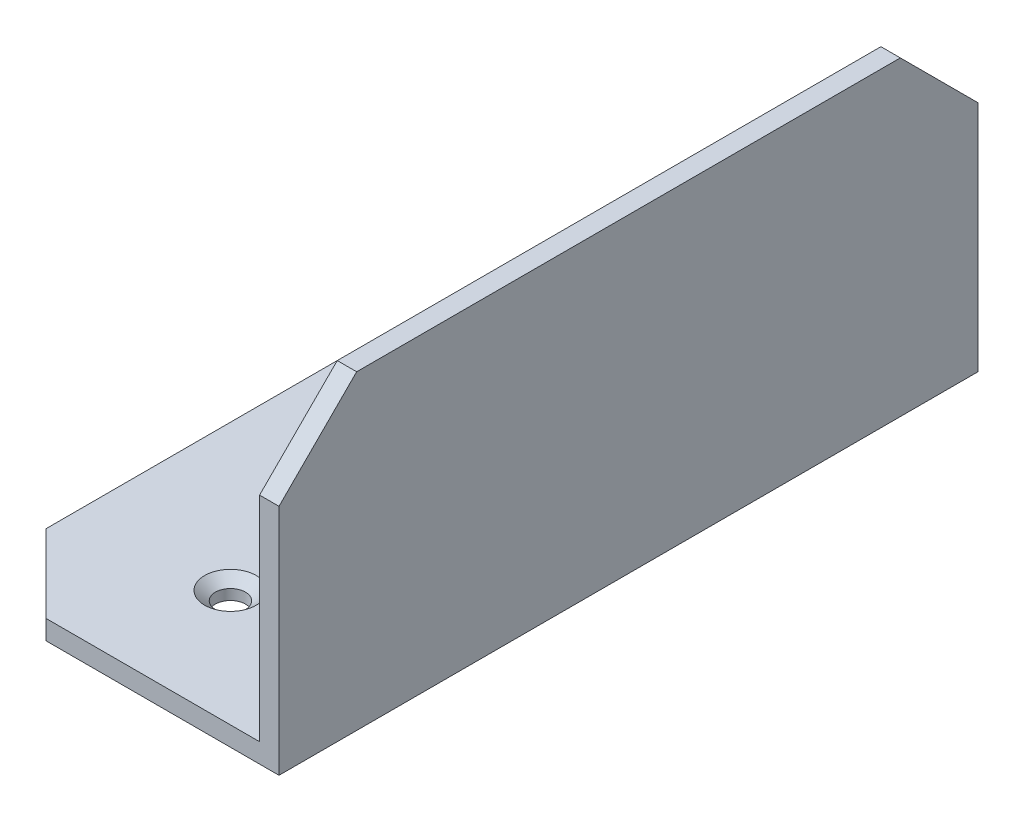
ISO-10303-21;
HEADER;
FILE_DESCRIPTION(('STEP AP214'),'2;1');
FILE_NAME('part.step','',(''),(''),'','','');
FILE_SCHEMA(('AUTOMOTIVE_DESIGN { 1 0 10303 214 1 1 1 1 }'));
ENDSEC;
DATA;
#1=APPLICATION_CONTEXT('core data for automotive mechanical design processes');
#2=APPLICATION_PROTOCOL_DEFINITION('international standard','automotive_design',2000,#1);
#3=PRODUCT_CONTEXT('',#1,'mechanical');
#4=PRODUCT('Part','Part','',(#3));
#5=PRODUCT_RELATED_PRODUCT_CATEGORY('part','',(#4));
#6=PRODUCT_DEFINITION_FORMATION('','',#4);
#7=PRODUCT_DEFINITION_CONTEXT('part definition',#1,'design');
#8=PRODUCT_DEFINITION('design','',#6,#7);
#9=PRODUCT_DEFINITION_SHAPE('','',#8);
#10=(LENGTH_UNIT() NAMED_UNIT(*) SI_UNIT(.MILLI.,.METRE.));
#11=(NAMED_UNIT(*) PLANE_ANGLE_UNIT() SI_UNIT($,.RADIAN.));
#12=(NAMED_UNIT(*) SI_UNIT($,.STERADIAN.) SOLID_ANGLE_UNIT());
#13=UNCERTAINTY_MEASURE_WITH_UNIT(LENGTH_MEASURE(1.E-05),#10,'distance_accuracy_value','');
#14=(GEOMETRIC_REPRESENTATION_CONTEXT(3) GLOBAL_UNCERTAINTY_ASSIGNED_CONTEXT((#13)) GLOBAL_UNIT_ASSIGNED_CONTEXT((#10,
#11,#12)) REPRESENTATION_CONTEXT('',''));
#15=CARTESIAN_POINT('',(0.,0.,0.));
#16=DIRECTION('',(0.,0.,1.));
#17=DIRECTION('',(1.,0.,0.));
#18=AXIS2_PLACEMENT_3D('',#15,#16,#17);
#19=CARTESIAN_POINT('',(0.,0.,-114.3));
#20=DIRECTION('',(0.,-1.,0.));
#21=DIRECTION('',(0.,0.,-1.));
#22=AXIS2_PLACEMENT_3D('',#19,#20,#21);
#23=PLANE('',#22);
#24=CARTESIAN_POINT('',(-26.9875,0.,-19.05));
#25=DIRECTION('',(0.,1.,0.));
#26=DIRECTION('',(0.,0.,1.));
#27=AXIS2_PLACEMENT_3D('',#24,#25,#26);
#28=CIRCLE('',#27,2.45745);
#29=CARTESIAN_POINT('',(-26.9875,0.,-16.59255));
#30=VERTEX_POINT('',#29);
#31=EDGE_CURVE('E382',#30,#30,#28,.T.);
#32=ORIENTED_EDGE('',*,*,#31,.T.);
#33=EDGE_LOOP('',(#32));
#34=FACE_BOUND('',#33,.T.);
#35=CARTESIAN_POINT('',(-26.9875,0.,-57.15));
#36=DIRECTION('',(0.,1.,0.));
#37=DIRECTION('',(0.,0.,1.));
#38=AXIS2_PLACEMENT_3D('',#35,#36,#37);
#39=CIRCLE('',#38,2.45745);
#40=CARTESIAN_POINT('',(-26.9875,0.,-54.69255));
#41=VERTEX_POINT('',#40);
#42=EDGE_CURVE('E392',#41,#41,#39,.T.);
#43=ORIENTED_EDGE('',*,*,#42,.T.);
#44=EDGE_LOOP('',(#43));
#45=FACE_BOUND('',#44,.T.);
#46=CARTESIAN_POINT('',(-26.9875,0.,-95.25));
#47=DIRECTION('',(0.,1.,0.));
#48=DIRECTION('',(0.,0.,1.));
#49=AXIS2_PLACEMENT_3D('',#46,#47,#48);
#50=CIRCLE('',#49,2.45745);
#51=CARTESIAN_POINT('',(-26.9875,0.,-92.79255));
#52=VERTEX_POINT('',#51);
#53=EDGE_CURVE('E147',#52,#52,#50,.T.);
#54=ORIENTED_EDGE('',*,*,#53,.T.);
#55=EDGE_LOOP('',(#54));
#56=FACE_BOUND('',#55,.T.);
#57=DIRECTION('',(0.,0.,1.));
#58=VECTOR('',#57,1.);
#59=CARTESIAN_POINT('',(-50.8,0.,-114.3));
#60=LINE('',#59,#58);
#61=CARTESIAN_POINT('',(-50.8,0.,-101.6));
#62=VERTEX_POINT('',#61);
#63=CARTESIAN_POINT('',(-50.8,0.,-12.7000000000001));
#64=VERTEX_POINT('',#63);
#65=EDGE_CURVE('E153',#62,#64,#60,.T.);
#66=ORIENTED_EDGE('',*,*,#65,.F.);
#67=DIRECTION('',(-0.707106781186549,0.,0.707106781186546));
#68=VECTOR('',#67,1.);
#69=CARTESIAN_POINT('',(-19.0499999999999,0.,-133.35));
#70=LINE('',#69,#68);
#71=CARTESIAN_POINT('',(-38.0999999999999,0.,-114.3));
#72=VERTEX_POINT('',#71);
#73=EDGE_CURVE('E120',#62,#72,#70,.F.);
#74=ORIENTED_EDGE('',*,*,#73,.T.);
#75=DIRECTION('',(1.,0.,0.));
#76=VECTOR('',#75,1.);
#77=CARTESIAN_POINT('',(0.,0.,-114.3));
#78=LINE('',#77,#76);
#79=CARTESIAN_POINT('',(0.,0.,-114.3));
#80=VERTEX_POINT('',#79);
#81=EDGE_CURVE('E115',#72,#80,#78,.T.);
#82=ORIENTED_EDGE('',*,*,#81,.T.);
#83=DIRECTION('',(0.,0.,1.));
#84=VECTOR('',#83,1.);
#85=CARTESIAN_POINT('',(0.,0.,-114.3));
#86=LINE('',#85,#84);
#87=CARTESIAN_POINT('',(0.,0.,0.));
#88=VERTEX_POINT('',#87);
#89=EDGE_CURVE('E119',#80,#88,#86,.T.);
#90=ORIENTED_EDGE('',*,*,#89,.T.);
#91=DIRECTION('',(1.,0.,0.));
#92=VECTOR('',#91,1.);
#93=CARTESIAN_POINT('',(0.,0.,0.));
#94=LINE('',#93,#92);
#95=CARTESIAN_POINT('',(-38.1,0.,0.));
#96=VERTEX_POINT('',#95);
#97=EDGE_CURVE('E145',#96,#88,#94,.T.);
#98=ORIENTED_EDGE('',*,*,#97,.F.);
#99=DIRECTION('',(-0.707106781186546,0.,-0.707106781186549));
#100=VECTOR('',#99,1.);
#101=CARTESIAN_POINT('',(-76.2000000000001,0.,-38.1000000000002));
#102=LINE('',#101,#100);
#103=EDGE_CURVE('E171',#96,#64,#102,.T.);
#104=ORIENTED_EDGE('',*,*,#103,.T.);
#105=EDGE_LOOP('',(#66,#74,#82,#90,#98,#104));
#106=FACE_BOUND('',#105,.T.);
#107=ADVANCED_FACE('F35',(#34,#45,#56,#106),#23,.T.);
#108=CARTESIAN_POINT('',(-50.8,0.,-114.3));
#109=DIRECTION('',(-1.,0.,0.));
#110=DIRECTION('',(0.,0.,1.));
#111=AXIS2_PLACEMENT_3D('',#108,#109,#110);
#112=PLANE('',#111);
#113=DIRECTION('',(0.,0.,1.));
#114=VECTOR('',#113,1.);
#115=CARTESIAN_POINT('',(-50.8,3.175,-114.3));
#116=LINE('',#115,#114);
#117=CARTESIAN_POINT('',(-50.8,3.175,-101.6));
#118=VERTEX_POINT('',#117);
#119=CARTESIAN_POINT('',(-50.8,3.175,-12.7000000000001));
#120=VERTEX_POINT('',#119);
#121=EDGE_CURVE('E157',#118,#120,#116,.T.);
#122=ORIENTED_EDGE('',*,*,#121,.F.);
#123=DIRECTION('',(0.,-1.,0.));
#124=VECTOR('',#123,1.);
#125=CARTESIAN_POINT('',(-50.8,0.,-101.6));
#126=LINE('',#125,#124);
#127=EDGE_CURVE('E168',#118,#62,#126,.T.);
#128=ORIENTED_EDGE('',*,*,#127,.T.);
#129=ORIENTED_EDGE('',*,*,#65,.T.);
#130=DIRECTION('',(0.,1.,0.));
#131=VECTOR('',#130,1.);
#132=CARTESIAN_POINT('',(-50.8,3.175,-12.7000000000001));
#133=LINE('',#132,#131);
#134=EDGE_CURVE('E156',#64,#120,#133,.T.);
#135=ORIENTED_EDGE('',*,*,#134,.T.);
#136=EDGE_LOOP('',(#122,#128,#129,#135));
#137=FACE_BOUND('',#136,.T.);
#138=ADVANCED_FACE('F201',(#137),#112,.T.);
#139=CARTESIAN_POINT('',(-3.175,3.175,-114.3));
#140=DIRECTION('',(0.,1.,0.));
#141=DIRECTION('',(0.,0.,1.));
#142=AXIS2_PLACEMENT_3D('',#139,#140,#141);
#143=PLANE('',#142);
#144=CARTESIAN_POINT('',(-26.9875,3.175,-19.05));
#145=DIRECTION('',(0.,1.,0.));
#146=DIRECTION('',(0.,0.,1.));
#147=AXIS2_PLACEMENT_3D('',#144,#145,#146);
#148=CIRCLE('',#147,4.2164);
#149=CARTESIAN_POINT('',(-26.9875,3.175,-14.8336));
#150=VERTEX_POINT('',#149);
#151=EDGE_CURVE('E380',#150,#150,#148,.T.);
#152=ORIENTED_EDGE('',*,*,#151,.F.);
#153=EDGE_LOOP('',(#152));
#154=FACE_BOUND('',#153,.T.);
#155=CARTESIAN_POINT('',(-26.9875,3.175,-57.15));
#156=DIRECTION('',(0.,1.,0.));
#157=DIRECTION('',(0.,0.,1.));
#158=AXIS2_PLACEMENT_3D('',#155,#156,#157);
#159=CIRCLE('',#158,4.2164);
#160=CARTESIAN_POINT('',(-26.9875,3.175,-52.9336));
#161=VERTEX_POINT('',#160);
#162=EDGE_CURVE('E386',#161,#161,#159,.T.);
#163=ORIENTED_EDGE('',*,*,#162,.F.);
#164=EDGE_LOOP('',(#163));
#165=FACE_BOUND('',#164,.T.);
#166=CARTESIAN_POINT('',(-26.9875,3.175,-95.25));
#167=DIRECTION('',(0.,1.,0.));
#168=DIRECTION('',(0.,0.,1.));
#169=AXIS2_PLACEMENT_3D('',#166,#167,#168);
#170=CIRCLE('',#169,4.2164);
#171=CARTESIAN_POINT('',(-26.9875,3.175,-91.0336));
#172=VERTEX_POINT('',#171);
#173=EDGE_CURVE('E395',#172,#172,#170,.T.);
#174=ORIENTED_EDGE('',*,*,#173,.F.);
#175=EDGE_LOOP('',(#174));
#176=FACE_BOUND('',#175,.T.);
#177=DIRECTION('',(-1.,0.,0.));
#178=VECTOR('',#177,1.);
#179=CARTESIAN_POINT('',(-3.175,3.175,-114.3));
#180=LINE('',#179,#178);
#181=CARTESIAN_POINT('',(-3.175,3.175,-114.3));
#182=VERTEX_POINT('',#181);
#183=CARTESIAN_POINT('',(-38.0999999999999,3.175,-114.3));
#184=VERTEX_POINT('',#183);
#185=EDGE_CURVE('E132',#182,#184,#180,.T.);
#186=ORIENTED_EDGE('',*,*,#185,.T.);
#187=DIRECTION('',(0.707106781186549,0.,-0.707106781186546));
#188=VECTOR('',#187,1.);
#189=CARTESIAN_POINT('',(-20.6374999999999,3.175,-131.7625));
#190=LINE('',#189,#188);
#191=EDGE_CURVE('E179',#184,#118,#190,.F.);
#192=ORIENTED_EDGE('',*,*,#191,.T.);
#193=ORIENTED_EDGE('',*,*,#121,.T.);
#194=DIRECTION('',(0.707106781186546,0.,0.707106781186549));
#195=VECTOR('',#194,1.);
#196=CARTESIAN_POINT('',(-77.7875000000001,3.175,-39.6875000000002));
#197=LINE('',#196,#195);
#198=CARTESIAN_POINT('',(-38.1,3.175,0.));
#199=VERTEX_POINT('',#198);
#200=EDGE_CURVE('E177',#120,#199,#197,.T.);
#201=ORIENTED_EDGE('',*,*,#200,.T.);
#202=DIRECTION('',(-1.,0.,0.));
#203=VECTOR('',#202,1.);
#204=CARTESIAN_POINT('',(-3.175,3.175,0.));
#205=LINE('',#204,#203);
#206=CARTESIAN_POINT('',(-3.175,3.175,0.));
#207=VERTEX_POINT('',#206);
#208=EDGE_CURVE('E125',#207,#199,#205,.T.);
#209=ORIENTED_EDGE('',*,*,#208,.F.);
#210=DIRECTION('',(0.,0.,1.));
#211=VECTOR('',#210,1.);
#212=CARTESIAN_POINT('',(-3.175,3.175,-114.3));
#213=LINE('',#212,#211);
#214=EDGE_CURVE('E160',#182,#207,#213,.T.);
#215=ORIENTED_EDGE('',*,*,#214,.F.);
#216=EDGE_LOOP('',(#186,#192,#193,#201,#209,#215));
#217=FACE_BOUND('',#216,.T.);
#218=ADVANCED_FACE('F204',(#154,#165,#176,#217),#143,.T.);
#219=CARTESIAN_POINT('',(-3.175,3.175,-114.3));
#220=DIRECTION('',(-1.,0.,0.));
#221=DIRECTION('',(0.,0.,1.));
#222=AXIS2_PLACEMENT_3D('',#219,#220,#221);
#223=PLANE('',#222);
#224=DIRECTION('',(0.,0.,1.));
#225=VECTOR('',#224,1.);
#226=CARTESIAN_POINT('',(-3.175,50.8,-114.3));
#227=LINE('',#226,#225);
#228=CARTESIAN_POINT('',(-3.175,50.8,-101.6));
#229=VERTEX_POINT('',#228);
#230=CARTESIAN_POINT('',(-3.175,50.8,-12.7000000000001));
#231=VERTEX_POINT('',#230);
#232=EDGE_CURVE('E163',#229,#231,#227,.T.);
#233=ORIENTED_EDGE('',*,*,#232,.F.);
#234=DIRECTION('',(0.,0.707106781186549,0.707106781186546));
#235=VECTOR('',#234,1.);
#236=CARTESIAN_POINT('',(-3.175,20.6374999999999,-131.7625));
#237=LINE('',#236,#235);
#238=CARTESIAN_POINT('',(-3.175,38.0999999999999,-114.3));
#239=VERTEX_POINT('',#238);
#240=EDGE_CURVE('E187',#229,#239,#237,.F.);
#241=ORIENTED_EDGE('',*,*,#240,.T.);
#242=DIRECTION('',(0.,-1.,0.));
#243=VECTOR('',#242,1.);
#244=CARTESIAN_POINT('',(-3.175,3.175,-114.3));
#245=LINE('',#244,#243);
#246=EDGE_CURVE('E138',#239,#182,#245,.T.);
#247=ORIENTED_EDGE('',*,*,#246,.T.);
#248=ORIENTED_EDGE('',*,*,#214,.T.);
#249=DIRECTION('',(0.,-1.,0.));
#250=VECTOR('',#249,1.);
#251=CARTESIAN_POINT('',(-3.175,3.175,0.));
#252=LINE('',#251,#250);
#253=CARTESIAN_POINT('',(-3.175,38.1,0.));
#254=VERTEX_POINT('',#253);
#255=EDGE_CURVE('E149',#254,#207,#252,.T.);
#256=ORIENTED_EDGE('',*,*,#255,.F.);
#257=DIRECTION('',(0.,0.707106781186546,-0.707106781186549));
#258=VECTOR('',#257,1.);
#259=CARTESIAN_POINT('',(-3.175,77.7875000000001,-39.6875000000002));
#260=LINE('',#259,#258);
#261=EDGE_CURVE('E59',#254,#231,#260,.T.);
#262=ORIENTED_EDGE('',*,*,#261,.T.);
#263=EDGE_LOOP('',(#233,#241,#247,#248,#256,#262));
#264=FACE_BOUND('',#263,.T.);
#265=ADVANCED_FACE('F213',(#264),#223,.T.);
#266=CARTESIAN_POINT('',(0.,50.8,-114.3));
#267=DIRECTION('',(0.,1.,0.));
#268=DIRECTION('',(0.,0.,1.));
#269=AXIS2_PLACEMENT_3D('',#266,#267,#268);
#270=PLANE('',#269);
#271=DIRECTION('',(0.,0.,1.));
#272=VECTOR('',#271,1.);
#273=CARTESIAN_POINT('',(0.,50.8,-114.3));
#274=LINE('',#273,#272);
#275=CARTESIAN_POINT('',(0.,50.8,-101.6));
#276=VERTEX_POINT('',#275);
#277=CARTESIAN_POINT('',(0.,50.8,-12.7000000000001));
#278=VERTEX_POINT('',#277);
#279=EDGE_CURVE('E131',#276,#278,#274,.T.);
#280=ORIENTED_EDGE('',*,*,#279,.F.);
#281=DIRECTION('',(-1.,0.,0.));
#282=VECTOR('',#281,1.);
#283=CARTESIAN_POINT('',(0.,50.8,-101.6));
#284=LINE('',#283,#282);
#285=EDGE_CURVE('E183',#276,#229,#284,.T.);
#286=ORIENTED_EDGE('',*,*,#285,.T.);
#287=ORIENTED_EDGE('',*,*,#232,.T.);
#288=DIRECTION('',(1.,0.,0.));
#289=VECTOR('',#288,1.);
#290=CARTESIAN_POINT('',(0.,50.8,-12.7000000000001));
#291=LINE('',#290,#289);
#292=EDGE_CURVE('E181',#231,#278,#291,.T.);
#293=ORIENTED_EDGE('',*,*,#292,.T.);
#294=EDGE_LOOP('',(#280,#286,#287,#293));
#295=FACE_BOUND('',#294,.T.);
#296=ADVANCED_FACE('F219',(#295),#270,.T.);
#297=CARTESIAN_POINT('',(0.,0.,-114.3));
#298=DIRECTION('',(1.,0.,0.));
#299=DIRECTION('',(0.,1.,0.));
#300=AXIS2_PLACEMENT_3D('',#297,#298,#299);
#301=PLANE('',#300);
#302=DIRECTION('',(0.,1.,0.));
#303=VECTOR('',#302,1.);
#304=CARTESIAN_POINT('',(0.,0.,-114.3));
#305=LINE('',#304,#303);
#306=CARTESIAN_POINT('',(0.,38.0999999999999,-114.3));
#307=VERTEX_POINT('',#306);
#308=EDGE_CURVE('E124',#80,#307,#305,.T.);
#309=ORIENTED_EDGE('',*,*,#308,.T.);
#310=DIRECTION('',(0.,-0.707106781186549,-0.707106781186546));
#311=VECTOR('',#310,1.);
#312=CARTESIAN_POINT('',(0.,19.0499999999999,-133.35));
#313=LINE('',#312,#311);
#314=EDGE_CURVE('E190',#307,#276,#313,.F.);
#315=ORIENTED_EDGE('',*,*,#314,.T.);
#316=ORIENTED_EDGE('',*,*,#279,.T.);
#317=DIRECTION('',(0.,-0.707106781186546,0.707106781186549));
#318=VECTOR('',#317,1.);
#319=CARTESIAN_POINT('',(0.,76.2000000000001,-38.1000000000002));
#320=LINE('',#319,#318);
#321=CARTESIAN_POINT('',(0.,38.1,0.));
#322=VERTEX_POINT('',#321);
#323=EDGE_CURVE('E51',#278,#322,#320,.T.);
#324=ORIENTED_EDGE('',*,*,#323,.T.);
#325=DIRECTION('',(0.,1.,0.));
#326=VECTOR('',#325,1.);
#327=CARTESIAN_POINT('',(0.,0.,0.));
#328=LINE('',#327,#326);
#329=EDGE_CURVE('E130',#88,#322,#328,.T.);
#330=ORIENTED_EDGE('',*,*,#329,.F.);
#331=ORIENTED_EDGE('',*,*,#89,.F.);
#332=EDGE_LOOP('',(#309,#315,#316,#324,#330,#331));
#333=FACE_BOUND('',#332,.T.);
#334=ADVANCED_FACE('F128',(#333),#301,.T.);
#335=CARTESIAN_POINT('',(0.,0.,-114.3));
#336=DIRECTION('',(0.,0.,-1.));
#337=DIRECTION('',(-1.,0.,0.));
#338=AXIS2_PLACEMENT_3D('',#335,#336,#337);
#339=PLANE('',#338);
#340=ORIENTED_EDGE('',*,*,#81,.F.);
#341=DIRECTION('',(0.,1.,0.));
#342=VECTOR('',#341,1.);
#343=CARTESIAN_POINT('',(-38.0999999999999,0.,-114.3));
#344=LINE('',#343,#342);
#345=EDGE_CURVE('E175',#72,#184,#344,.T.);
#346=ORIENTED_EDGE('',*,*,#345,.T.);
#347=ORIENTED_EDGE('',*,*,#185,.F.);
#348=ORIENTED_EDGE('',*,*,#246,.F.);
#349=DIRECTION('',(1.,0.,0.));
#350=VECTOR('',#349,1.);
#351=CARTESIAN_POINT('',(0.,38.0999999999999,-114.3));
#352=LINE('',#351,#350);
#353=EDGE_CURVE('E137',#239,#307,#352,.T.);
#354=ORIENTED_EDGE('',*,*,#353,.T.);
#355=ORIENTED_EDGE('',*,*,#308,.F.);
#356=EDGE_LOOP('',(#340,#346,#347,#348,#354,#355));
#357=FACE_BOUND('',#356,.T.);
#358=ADVANCED_FACE('F134',(#357),#339,.T.);
#359=CARTESIAN_POINT('',(0.,0.,0.));
#360=DIRECTION('',(0.,0.,-1.));
#361=DIRECTION('',(-1.,0.,0.));
#362=AXIS2_PLACEMENT_3D('',#359,#360,#361);
#363=PLANE('',#362);
#364=ORIENTED_EDGE('',*,*,#329,.T.);
#365=DIRECTION('',(-1.,0.,0.));
#366=VECTOR('',#365,1.);
#367=CARTESIAN_POINT('',(-3.175,38.1,0.));
#368=LINE('',#367,#366);
#369=EDGE_CURVE('E11',#322,#254,#368,.T.);
#370=ORIENTED_EDGE('',*,*,#369,.T.);
#371=ORIENTED_EDGE('',*,*,#255,.T.);
#372=ORIENTED_EDGE('',*,*,#208,.T.);
#373=DIRECTION('',(0.,-1.,0.));
#374=VECTOR('',#373,1.);
#375=CARTESIAN_POINT('',(-38.1,0.,0.));
#376=LINE('',#375,#374);
#377=EDGE_CURVE('E44',#199,#96,#376,.T.);
#378=ORIENTED_EDGE('',*,*,#377,.T.);
#379=ORIENTED_EDGE('',*,*,#97,.T.);
#380=EDGE_LOOP('',(#364,#370,#371,#372,#378,#379));
#381=FACE_BOUND('',#380,.T.);
#382=ADVANCED_FACE('F194',(#381),#363,.F.);
#383=CARTESIAN_POINT('',(-50.8,0.,-101.6));
#384=DIRECTION('',(0.707106781186546,0.,0.707106781186549));
#385=DIRECTION('',(0.,-1.,0.));
#386=AXIS2_PLACEMENT_3D('',#383,#384,#385);
#387=PLANE('',#386);
#388=ORIENTED_EDGE('',*,*,#191,.F.);
#389=ORIENTED_EDGE('',*,*,#345,.F.);
#390=ORIENTED_EDGE('',*,*,#73,.F.);
#391=ORIENTED_EDGE('',*,*,#127,.F.);
#392=EDGE_LOOP('',(#388,#389,#390,#391));
#393=FACE_BOUND('',#392,.T.);
#394=ADVANCED_FACE('F208',(#393),#387,.F.);
#395=CARTESIAN_POINT('',(0.,50.8,-101.6));
#396=DIRECTION('',(0.,-0.707106781186546,0.707106781186549));
#397=DIRECTION('',(-1.,0.,0.));
#398=AXIS2_PLACEMENT_3D('',#395,#396,#397);
#399=PLANE('',#398);
#400=ORIENTED_EDGE('',*,*,#314,.F.);
#401=ORIENTED_EDGE('',*,*,#353,.F.);
#402=ORIENTED_EDGE('',*,*,#240,.F.);
#403=ORIENTED_EDGE('',*,*,#285,.F.);
#404=EDGE_LOOP('',(#400,#401,#402,#403));
#405=FACE_BOUND('',#404,.T.);
#406=ADVANCED_FACE('F215',(#405),#399,.F.);
#407=CARTESIAN_POINT('',(0.,38.1,0.));
#408=DIRECTION('',(0.,0.707106781186549,0.707106781186546));
#409=DIRECTION('',(1.,0.,0.));
#410=AXIS2_PLACEMENT_3D('',#407,#408,#409);
#411=PLANE('',#410);
#412=ORIENTED_EDGE('',*,*,#323,.F.);
#413=ORIENTED_EDGE('',*,*,#292,.F.);
#414=ORIENTED_EDGE('',*,*,#261,.F.);
#415=ORIENTED_EDGE('',*,*,#369,.F.);
#416=EDGE_LOOP('',(#412,#413,#414,#415));
#417=FACE_BOUND('',#416,.T.);
#418=ADVANCED_FACE('F220',(#417),#411,.T.);
#419=CARTESIAN_POINT('',(-38.1,0.,0.));
#420=DIRECTION('',(-0.707106781186549,0.,0.707106781186546));
#421=DIRECTION('',(0.,1.,0.));
#422=AXIS2_PLACEMENT_3D('',#419,#420,#421);
#423=PLANE('',#422);
#424=ORIENTED_EDGE('',*,*,#200,.F.);
#425=ORIENTED_EDGE('',*,*,#134,.F.);
#426=ORIENTED_EDGE('',*,*,#103,.F.);
#427=ORIENTED_EDGE('',*,*,#377,.F.);
#428=EDGE_LOOP('',(#424,#425,#426,#427));
#429=FACE_BOUND('',#428,.T.);
#430=ADVANCED_FACE('F38',(#429),#423,.T.);
#431=CARTESIAN_POINT('',(-26.9875,3.175,-95.25));
#432=DIRECTION('',(0.,1.,0.));
#433=DIRECTION('',(0.,0.,1.));
#434=AXIS2_PLACEMENT_3D('',#431,#432,#433);
#435=CYLINDRICAL_SURFACE('',#434,2.45745);
#436=ORIENTED_EDGE('',*,*,#53,.F.);
#437=EDGE_LOOP('',(#436));
#438=FACE_BOUND('',#437,.T.);
#439=CARTESIAN_POINT('',(-26.9875,1.69906570374072,-95.25));
#440=DIRECTION('',(0.,1.,0.));
#441=DIRECTION('',(0.,0.,1.));
#442=AXIS2_PLACEMENT_3D('',#439,#440,#441);
#443=CIRCLE('',#442,2.45745);
#444=CARTESIAN_POINT('',(-26.9875,1.69906570374072,-92.79255));
#445=VERTEX_POINT('',#444);
#446=EDGE_CURVE('E398',#445,#445,#443,.T.);
#447=ORIENTED_EDGE('',*,*,#446,.T.);
#448=EDGE_LOOP('',(#447));
#449=FACE_BOUND('',#448,.T.);
#450=ADVANCED_FACE('F226',(#438,#449),#435,.F.);
#451=CARTESIAN_POINT('',(-26.9875,3.175,-95.25));
#452=DIRECTION('',(0.,1.,0.));
#453=DIRECTION('',(0.,0.,1.));
#454=AXIS2_PLACEMENT_3D('',#451,#452,#453);
#455=CONICAL_SURFACE('',#454,4.2164,0.872664625997164);
#456=ORIENTED_EDGE('',*,*,#446,.F.);
#457=EDGE_LOOP('',(#456));
#458=FACE_BOUND('',#457,.T.);
#459=ORIENTED_EDGE('',*,*,#173,.T.);
#460=EDGE_LOOP('',(#459));
#461=FACE_BOUND('',#460,.T.);
#462=ADVANCED_FACE('F321',(#458,#461),#455,.F.);
#463=CARTESIAN_POINT('',(-26.9875,3.175,-57.15));
#464=DIRECTION('',(0.,1.,0.));
#465=DIRECTION('',(0.,0.,1.));
#466=AXIS2_PLACEMENT_3D('',#463,#464,#465);
#467=CYLINDRICAL_SURFACE('',#466,2.45745);
#468=ORIENTED_EDGE('',*,*,#42,.F.);
#469=EDGE_LOOP('',(#468));
#470=FACE_BOUND('',#469,.T.);
#471=CARTESIAN_POINT('',(-26.9875,1.69906570374072,-57.15));
#472=DIRECTION('',(0.,1.,0.));
#473=DIRECTION('',(0.,0.,1.));
#474=AXIS2_PLACEMENT_3D('',#471,#472,#473);
#475=CIRCLE('',#474,2.45745);
#476=CARTESIAN_POINT('',(-26.9875,1.69906570374072,-54.69255));
#477=VERTEX_POINT('',#476);
#478=EDGE_CURVE('E389',#477,#477,#475,.T.);
#479=ORIENTED_EDGE('',*,*,#478,.T.);
#480=EDGE_LOOP('',(#479));
#481=FACE_BOUND('',#480,.T.);
#482=ADVANCED_FACE('F330',(#470,#481),#467,.F.);
#483=CARTESIAN_POINT('',(-26.9875,3.175,-57.15));
#484=DIRECTION('',(0.,1.,0.));
#485=DIRECTION('',(0.,0.,1.));
#486=AXIS2_PLACEMENT_3D('',#483,#484,#485);
#487=CONICAL_SURFACE('',#486,4.2164,0.872664625997164);
#488=ORIENTED_EDGE('',*,*,#478,.F.);
#489=EDGE_LOOP('',(#488));
#490=FACE_BOUND('',#489,.T.);
#491=ORIENTED_EDGE('',*,*,#162,.T.);
#492=EDGE_LOOP('',(#491));
#493=FACE_BOUND('',#492,.T.);
#494=ADVANCED_FACE('F340',(#490,#493),#487,.F.);
#495=CARTESIAN_POINT('',(-26.9875,3.175,-19.05));
#496=DIRECTION('',(0.,1.,0.));
#497=DIRECTION('',(0.,0.,1.));
#498=AXIS2_PLACEMENT_3D('',#495,#496,#497);
#499=CYLINDRICAL_SURFACE('',#498,2.45745);
#500=ORIENTED_EDGE('',*,*,#31,.F.);
#501=EDGE_LOOP('',(#500));
#502=FACE_BOUND('',#501,.T.);
#503=CARTESIAN_POINT('',(-26.9875,1.69906570374072,-19.05));
#504=DIRECTION('',(0.,1.,0.));
#505=DIRECTION('',(0.,0.,1.));
#506=AXIS2_PLACEMENT_3D('',#503,#504,#505);
#507=CIRCLE('',#506,2.45745);
#508=CARTESIAN_POINT('',(-26.9875,1.69906570374072,-16.59255));
#509=VERTEX_POINT('',#508);
#510=EDGE_CURVE('E377',#509,#509,#507,.T.);
#511=ORIENTED_EDGE('',*,*,#510,.T.);
#512=EDGE_LOOP('',(#511));
#513=FACE_BOUND('',#512,.T.);
#514=ADVANCED_FACE('F350',(#502,#513),#499,.F.);
#515=CARTESIAN_POINT('',(-26.9875,3.175,-19.05));
#516=DIRECTION('',(0.,1.,0.));
#517=DIRECTION('',(0.,0.,1.));
#518=AXIS2_PLACEMENT_3D('',#515,#516,#517);
#519=CONICAL_SURFACE('',#518,4.2164,0.872664625997164);
#520=ORIENTED_EDGE('',*,*,#510,.F.);
#521=EDGE_LOOP('',(#520));
#522=FACE_BOUND('',#521,.T.);
#523=ORIENTED_EDGE('',*,*,#151,.T.);
#524=EDGE_LOOP('',(#523));
#525=FACE_BOUND('',#524,.T.);
#526=ADVANCED_FACE('F360',(#522,#525),#519,.F.);
#527=CLOSED_SHELL('',(#107,#138,#218,#265,#296,#334,#358,#382,#394,#406,#418,#430,#450,#462,
#482,#494,#514,#526));
#528=MANIFOLD_SOLID_BREP('B2',#527);
#529=ADVANCED_BREP_SHAPE_REPRESENTATION('',(#18,#528),#14);
#530=SHAPE_DEFINITION_REPRESENTATION(#9,#529);
ENDSEC;
END-ISO-10303-21;
